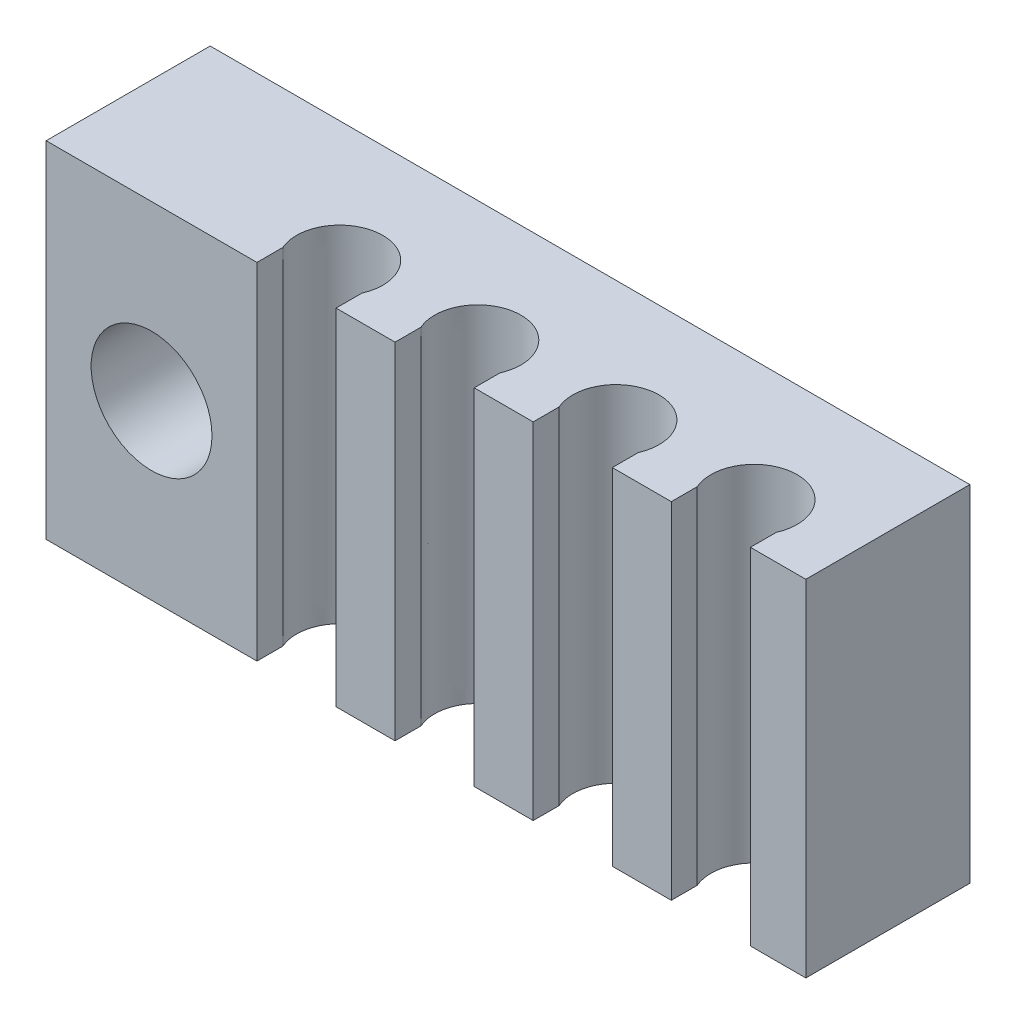
ISO-10303-21;
HEADER;
FILE_DESCRIPTION(('STEP AP214'),'2;1');
FILE_NAME('part.step','',(''),(''),'','','');
FILE_SCHEMA(('AUTOMOTIVE_DESIGN { 1 0 10303 214 1 1 1 1 }'));
ENDSEC;
DATA;
#1=APPLICATION_CONTEXT('core data for automotive mechanical design processes');
#2=APPLICATION_PROTOCOL_DEFINITION('international standard','automotive_design',2000,#1);
#3=PRODUCT_CONTEXT('',#1,'mechanical');
#4=PRODUCT('Part','Part','',(#3));
#5=PRODUCT_RELATED_PRODUCT_CATEGORY('part','',(#4));
#6=PRODUCT_DEFINITION_FORMATION('','',#4);
#7=PRODUCT_DEFINITION_CONTEXT('part definition',#1,'design');
#8=PRODUCT_DEFINITION('design','',#6,#7);
#9=PRODUCT_DEFINITION_SHAPE('','',#8);
#10=(LENGTH_UNIT() NAMED_UNIT(*) SI_UNIT(.MILLI.,.METRE.));
#11=(NAMED_UNIT(*) PLANE_ANGLE_UNIT() SI_UNIT($,.RADIAN.));
#12=(NAMED_UNIT(*) SI_UNIT($,.STERADIAN.) SOLID_ANGLE_UNIT());
#13=UNCERTAINTY_MEASURE_WITH_UNIT(LENGTH_MEASURE(1.E-05),#10,'distance_accuracy_value','');
#14=(GEOMETRIC_REPRESENTATION_CONTEXT(3) GLOBAL_UNCERTAINTY_ASSIGNED_CONTEXT((#13)) GLOBAL_UNIT_ASSIGNED_CONTEXT((#10,
#11,#12)) REPRESENTATION_CONTEXT('',''));
#15=CARTESIAN_POINT('',(0.,0.,0.));
#16=DIRECTION('',(0.,0.,1.));
#17=DIRECTION('',(1.,0.,0.));
#18=AXIS2_PLACEMENT_3D('',#15,#16,#17);
#19=CARTESIAN_POINT('',(1.10435607626104,10.,0.));
#20=DIRECTION('',(1.,0.,0.));
#21=DIRECTION('',(0.,0.,-1.));
#22=AXIS2_PLACEMENT_3D('',#19,#20,#21);
#23=PLANE('',#22);
#24=DIRECTION('',(0.,0.,1.));
#25=VECTOR('',#24,1.);
#26=CARTESIAN_POINT('',(1.10435607626104,0.,0.));
#27=LINE('',#26,#25);
#28=CARTESIAN_POINT('',(1.10435607626104,0.,0.));
#29=VERTEX_POINT('',#28);
#30=CARTESIAN_POINT('',(1.10435607626104,0.,0.750000000000005));
#31=VERTEX_POINT('',#30);
#32=EDGE_CURVE('E356',#29,#31,#27,.T.);
#33=ORIENTED_EDGE('',*,*,#32,.F.);
#34=CARTESIAN_POINT('',(1.10435607626104,10.,0.));
#35=DIRECTION('',(0.,-1.,0.));
#36=VECTOR('',#35,1.);
#37=LINE('',#34,#36);
#38=CARTESIAN_POINT('',(1.10435607626104,10.,0.));
#39=VERTEX_POINT('',#38);
#40=EDGE_CURVE('E11',#39,#29,#37,.T.);
#41=ORIENTED_EDGE('',*,*,#40,.F.);
#42=DIRECTION('',(0.,0.,1.));
#43=VECTOR('',#42,1.);
#44=CARTESIAN_POINT('',(1.10435607626104,10.,0.));
#45=LINE('',#44,#43);
#46=CARTESIAN_POINT('',(1.10435607626104,10.,0.750000000000005));
#47=VERTEX_POINT('',#46);
#48=EDGE_CURVE('E466',#39,#47,#45,.T.);
#49=ORIENTED_EDGE('',*,*,#48,.T.);
#50=DIRECTION('',(0.,-1.,0.));
#51=VECTOR('',#50,1.);
#52=CARTESIAN_POINT('',(1.10435607626104,10.,0.750000000000005));
#53=LINE('',#52,#51);
#54=EDGE_CURVE('E131',#47,#31,#53,.T.);
#55=ORIENTED_EDGE('',*,*,#54,.T.);
#56=EDGE_LOOP('',(#33,#41,#49,#55));
#57=FACE_BOUND('',#56,.T.);
#58=ADVANCED_FACE('F41',(#57),#23,.T.);
#59=CARTESIAN_POINT('',(3.39564392373896,10.,0.));
#60=CARTESIAN_POINT('',(3.45779822897416,10.,-0.142413404253852));
#61=CARTESIAN_POINT('',(3.48328316904731,10.,-0.296253527773759));
#62=CARTESIAN_POINT('',(3.50863389329829,10.,-0.449283455994029));
#63=CARTESIAN_POINT('',(3.49558614575293,10.,-0.604953101470896));
#64=CARTESIAN_POINT('',(3.48263027463405,10.,-0.75952659064273));
#65=CARTESIAN_POINT('',(3.43180131488979,10.,-0.907241515718572));
#66=CARTESIAN_POINT('',(3.38133027003981,10.,-1.05391629808722));
#67=CARTESIAN_POINT('',(3.29582503316759,10.,-1.18465319688146));
#68=CARTESIAN_POINT('',(3.21092188608777,10.,-1.3144695046671));
#69=CARTESIAN_POINT('',(3.0959635403377,10.,-1.42024219008873));
#70=CARTESIAN_POINT('',(2.98181468005355,10.,-1.52527007137299));
#71=CARTESIAN_POINT('',(2.84442556468332,10.,-1.59961731891186));
#72=CARTESIAN_POINT('',(2.70800388226732,10.,-1.6734410462495));
#73=CARTESIAN_POINT('',(2.55657654130753,10.,-1.71182128398536));
#74=CARTESIAN_POINT('',(2.40621548423372,10.,-1.74993126518247));
#75=CARTESIAN_POINT('',(2.25,10.,-1.75));
#76=CARTESIAN_POINT('',(2.09488451562459,10.,-1.75006825081757));
#77=CARTESIAN_POINT('',(1.94342345869247,10.,-1.71182128398536));
#78=CARTESIAN_POINT('',(1.79302892305929,10.,-1.67384363525757));
#79=CARTESIAN_POINT('',(1.65557443531667,10.,-1.59961731891186));
#80=CARTESIAN_POINT('',(1.51908784085161,10.,-1.5259136712239));
#81=CARTESIAN_POINT('',(1.4040364596623,10.,-1.42024219008873));
#82=CARTESIAN_POINT('',(1.28979521905302,10.,-1.31531480045542));
#83=CARTESIAN_POINT('',(1.2041749668324,10.,-1.18465319688146));
#84=CARTESIAN_POINT('',(1.11915761429082,10.,-1.05491165412037));
#85=CARTESIAN_POINT('',(1.06819868511021,10.,-0.907241515718572));
#86=CARTESIAN_POINT('',(1.01759858601069,10.,-0.760611204655972));
#87=CARTESIAN_POINT('',(1.00441385424707,10.,-0.604953101470895));
#88=CARTESIAN_POINT('',(0.991321963491766,10.,-0.450391073314972));
#89=CARTESIAN_POINT('',(1.0167168309527,10.,-0.296253527773758));
#90=CARTESIAN_POINT('',(1.04197835850478,10.,-0.142925306648315));
#91=CARTESIAN_POINT('',(1.10435607626104,10.,0.));
#92=B_SPLINE_CURVE_WITH_KNOTS('',2,(#59,#60,#61,#62,#63,#64,#65,#66,#67,#68,#69,#70,#71,#72,#73,
#74,#75,#76,#77,#78,#79,#80,#81,#82,#83,#84,#85,#86,#87,#88,#89,#90,#91),.UNSPECIFIED.,.F.,.F.,
(3,2,2,2,2,2,2,2,2,2,2,2,2,2,2,2,3),(0.,0.0625,0.125,0.1875,0.25,0.3125,0.375,0.4375,0.5,0.5625,
0.625,0.6875,0.75,0.8125,0.875,0.9375,1.),.UNSPECIFIED.);
#93=DIRECTION('',(0.,-1.,0.));
#94=VECTOR('',#93,1.);
#95=SURFACE_OF_LINEAR_EXTRUSION('',#92,#94);
#96=CARTESIAN_POINT('',(1.10435607626104,0.,0.));
#97=CARTESIAN_POINT('',(1.04197835850478,0.,-0.142925306648315));
#98=CARTESIAN_POINT('',(1.0167168309527,0.,-0.296253527773758));
#99=CARTESIAN_POINT('',(0.991321963491766,0.,-0.450391073314972));
#100=CARTESIAN_POINT('',(1.00441385424707,0.,-0.604953101470895));
#101=CARTESIAN_POINT('',(1.01759858601069,0.,-0.760611204655972));
#102=CARTESIAN_POINT('',(1.06819868511021,0.,-0.907241515718572));
#103=CARTESIAN_POINT('',(1.11915761429082,0.,-1.05491165412037));
#104=CARTESIAN_POINT('',(1.2041749668324,0.,-1.18465319688146));
#105=CARTESIAN_POINT('',(1.28979521905302,0.,-1.31531480045542));
#106=CARTESIAN_POINT('',(1.4040364596623,0.,-1.42024219008873));
#107=CARTESIAN_POINT('',(1.51908784085161,0.,-1.5259136712239));
#108=CARTESIAN_POINT('',(1.65557443531667,0.,-1.59961731891186));
#109=CARTESIAN_POINT('',(1.79302892305929,0.,-1.67384363525757));
#110=CARTESIAN_POINT('',(1.94342345869247,0.,-1.71182128398536));
#111=CARTESIAN_POINT('',(2.09488451562459,0.,-1.75006825081757));
#112=CARTESIAN_POINT('',(2.25,0.,-1.75));
#113=CARTESIAN_POINT('',(2.40621548423372,0.,-1.74993126518247));
#114=CARTESIAN_POINT('',(2.55657654130753,0.,-1.71182128398536));
#115=CARTESIAN_POINT('',(2.70800388226732,0.,-1.6734410462495));
#116=CARTESIAN_POINT('',(2.84442556468332,0.,-1.59961731891186));
#117=CARTESIAN_POINT('',(2.98181468005355,0.,-1.52527007137299));
#118=CARTESIAN_POINT('',(3.0959635403377,0.,-1.42024219008873));
#119=CARTESIAN_POINT('',(3.21092188608777,0.,-1.3144695046671));
#120=CARTESIAN_POINT('',(3.29582503316759,0.,-1.18465319688146));
#121=CARTESIAN_POINT('',(3.38133027003981,0.,-1.05391629808722));
#122=CARTESIAN_POINT('',(3.43180131488979,0.,-0.907241515718572));
#123=CARTESIAN_POINT('',(3.48263027463405,0.,-0.75952659064273));
#124=CARTESIAN_POINT('',(3.49558614575293,0.,-0.604953101470896));
#125=CARTESIAN_POINT('',(3.50863389329829,0.,-0.449283455994029));
#126=CARTESIAN_POINT('',(3.48328316904731,0.,-0.296253527773759));
#127=CARTESIAN_POINT('',(3.45779822897416,0.,-0.142413404253852));
#128=CARTESIAN_POINT('',(3.39564392373896,0.,0.));
#129=B_SPLINE_CURVE_WITH_KNOTS('',2,(#96,#97,#98,#99,#100,#101,#102,#103,#104,#105,#106,#107,
#108,#109,#110,#111,#112,#113,#114,#115,#116,#117,#118,#119,#120,#121,#122,#123,#124,#125,#126,
#127,#128),.UNSPECIFIED.,.F.,.F.,(3,2,2,2,2,2,2,2,2,2,2,2,2,2,2,2,3),(0.,0.0625,0.125,0.1875,
0.25,0.3125,0.375,0.4375,0.5,0.5625,0.625,0.6875,0.75,0.8125,0.875,0.9375,1.),.UNSPECIFIED.);
#130=CARTESIAN_POINT('',(3.39564392373896,0.,0.));
#131=VERTEX_POINT('',#130);
#132=EDGE_CURVE('E352',#131,#29,#129,.F.);
#133=ORIENTED_EDGE('',*,*,#132,.F.);
#134=CARTESIAN_POINT('',(3.39564392373896,0.,0.));
#135=DIRECTION('',(0.,1.,0.));
#136=VECTOR('',#135,1.);
#137=LINE('',#134,#136);
#138=CARTESIAN_POINT('',(3.39564392373896,10.,0.));
#139=VERTEX_POINT('',#138);
#140=EDGE_CURVE('E52',#139,#131,#137,.F.);
#141=ORIENTED_EDGE('',*,*,#140,.F.);
#142=CARTESIAN_POINT('',(3.39564392373896,10.,0.));
#143=CARTESIAN_POINT('',(3.45779822897416,10.,-0.142413404253852));
#144=CARTESIAN_POINT('',(3.48328316904731,10.,-0.296253527773759));
#145=CARTESIAN_POINT('',(3.50863389329829,10.,-0.449283455994029));
#146=CARTESIAN_POINT('',(3.49558614575293,10.,-0.604953101470896));
#147=CARTESIAN_POINT('',(3.48263027463405,10.,-0.75952659064273));
#148=CARTESIAN_POINT('',(3.43180131488979,10.,-0.907241515718572));
#149=CARTESIAN_POINT('',(3.38133027003981,10.,-1.05391629808722));
#150=CARTESIAN_POINT('',(3.29582503316759,10.,-1.18465319688146));
#151=CARTESIAN_POINT('',(3.21092188608777,10.,-1.3144695046671));
#152=CARTESIAN_POINT('',(3.0959635403377,10.,-1.42024219008873));
#153=CARTESIAN_POINT('',(2.98181468005355,10.,-1.52527007137299));
#154=CARTESIAN_POINT('',(2.84442556468332,10.,-1.59961731891186));
#155=CARTESIAN_POINT('',(2.70800388226732,10.,-1.6734410462495));
#156=CARTESIAN_POINT('',(2.55657654130753,10.,-1.71182128398536));
#157=CARTESIAN_POINT('',(2.40621548423372,10.,-1.74993126518247));
#158=CARTESIAN_POINT('',(2.25,10.,-1.75));
#159=CARTESIAN_POINT('',(2.09488451562459,10.,-1.75006825081757));
#160=CARTESIAN_POINT('',(1.94342345869247,10.,-1.71182128398536));
#161=CARTESIAN_POINT('',(1.79302892305929,10.,-1.67384363525757));
#162=CARTESIAN_POINT('',(1.65557443531667,10.,-1.59961731891186));
#163=CARTESIAN_POINT('',(1.51908784085161,10.,-1.5259136712239));
#164=CARTESIAN_POINT('',(1.4040364596623,10.,-1.42024219008873));
#165=CARTESIAN_POINT('',(1.28979521905302,10.,-1.31531480045542));
#166=CARTESIAN_POINT('',(1.2041749668324,10.,-1.18465319688146));
#167=CARTESIAN_POINT('',(1.11915761429082,10.,-1.05491165412037));
#168=CARTESIAN_POINT('',(1.06819868511021,10.,-0.907241515718572));
#169=CARTESIAN_POINT('',(1.01759858601069,10.,-0.760611204655972));
#170=CARTESIAN_POINT('',(1.00441385424707,10.,-0.604953101470895));
#171=CARTESIAN_POINT('',(0.991321963491766,10.,-0.450391073314972));
#172=CARTESIAN_POINT('',(1.0167168309527,10.,-0.296253527773758));
#173=CARTESIAN_POINT('',(1.04197835850478,10.,-0.142925306648315));
#174=CARTESIAN_POINT('',(1.10435607626104,10.,0.));
#175=B_SPLINE_CURVE_WITH_KNOTS('',2,(#142,#143,#144,#145,#146,#147,#148,#149,#150,#151,#152,
#153,#154,#155,#156,#157,#158,#159,#160,#161,#162,#163,#164,#165,#166,#167,#168,#169,#170,#171,
#172,#173,#174),.UNSPECIFIED.,.F.,.F.,(3,2,2,2,2,2,2,2,2,2,2,2,2,2,2,2,3),(0.,0.0625,0.125,
0.1875,0.25,0.3125,0.375,0.4375,0.5,0.5625,0.625,0.6875,0.75,0.8125,0.875,0.9375,1.),.UNSPECIFIED.);
#176=EDGE_CURVE('E354',#139,#39,#175,.T.);
#177=ORIENTED_EDGE('',*,*,#176,.T.);
#178=ORIENTED_EDGE('',*,*,#40,.T.);
#179=EDGE_LOOP('',(#133,#141,#177,#178));
#180=FACE_BOUND('',#179,.T.);
#181=ADVANCED_FACE('F312',(#180),#95,.T.);
#182=CARTESIAN_POINT('',(3.39564392373896,10.,0.));
#183=DIRECTION('',(1.,0.,0.));
#184=DIRECTION('',(0.,0.,-1.));
#185=AXIS2_PLACEMENT_3D('',#182,#183,#184);
#186=PLANE('',#185);
#187=DIRECTION('',(0.,0.,1.));
#188=VECTOR('',#187,1.);
#189=CARTESIAN_POINT('',(3.39564392373896,0.,0.));
#190=LINE('',#189,#188);
#191=CARTESIAN_POINT('',(3.39564392373896,0.,0.750000000000006));
#192=VERTEX_POINT('',#191);
#193=EDGE_CURVE('E362',#131,#192,#190,.T.);
#194=ORIENTED_EDGE('',*,*,#193,.T.);
#195=DIRECTION('',(0.,-1.,0.));
#196=VECTOR('',#195,1.);
#197=CARTESIAN_POINT('',(3.39564392373896,10.,0.750000000000006));
#198=LINE('',#197,#196);
#199=CARTESIAN_POINT('',(3.39564392373896,10.,0.750000000000006));
#200=VERTEX_POINT('',#199);
#201=EDGE_CURVE('E381',#200,#192,#198,.T.);
#202=ORIENTED_EDGE('',*,*,#201,.F.);
#203=DIRECTION('',(0.,0.,1.));
#204=VECTOR('',#203,1.);
#205=CARTESIAN_POINT('',(3.39564392373896,10.,0.));
#206=LINE('',#205,#204);
#207=EDGE_CURVE('E380',#139,#200,#206,.T.);
#208=ORIENTED_EDGE('',*,*,#207,.F.);
#209=ORIENTED_EDGE('',*,*,#140,.T.);
#210=EDGE_LOOP('',(#194,#202,#208,#209));
#211=FACE_BOUND('',#210,.T.);
#212=ADVANCED_FACE('F316',(#211),#186,.F.);
#213=CARTESIAN_POINT('',(0.,10.,0.750000000000004));
#214=DIRECTION('',(0.,0.,-1.));
#215=DIRECTION('',(-1.,0.,0.));
#216=AXIS2_PLACEMENT_3D('',#213,#214,#215);
#217=PLANE('',#216);
#218=DIRECTION('',(1.,0.,0.));
#219=VECTOR('',#218,1.);
#220=CARTESIAN_POINT('',(0.,0.,0.750000000000004));
#221=LINE('',#220,#219);
#222=CARTESIAN_POINT('',(5.10435607626104,0.,0.750000000000007));
#223=VERTEX_POINT('',#222);
#224=EDGE_CURVE('E212',#192,#223,#221,.T.);
#225=ORIENTED_EDGE('',*,*,#224,.T.);
#226=DIRECTION('',(0.,-1.,0.));
#227=VECTOR('',#226,1.);
#228=CARTESIAN_POINT('',(5.10435607626104,10.,0.750000000000007));
#229=LINE('',#228,#227);
#230=CARTESIAN_POINT('',(5.10435607626104,10.,0.750000000000007));
#231=VERTEX_POINT('',#230);
#232=EDGE_CURVE('E382',#231,#223,#229,.T.);
#233=ORIENTED_EDGE('',*,*,#232,.F.);
#234=DIRECTION('',(1.,0.,0.));
#235=VECTOR('',#234,1.);
#236=CARTESIAN_POINT('',(0.,10.,0.750000000000004));
#237=LINE('',#236,#235);
#238=EDGE_CURVE('E444',#200,#231,#237,.T.);
#239=ORIENTED_EDGE('',*,*,#238,.F.);
#240=ORIENTED_EDGE('',*,*,#201,.T.);
#241=EDGE_LOOP('',(#225,#233,#239,#240));
#242=FACE_BOUND('',#241,.T.);
#243=ADVANCED_FACE('F443',(#242),#217,.F.);
#244=CARTESIAN_POINT('',(5.10435607626104,10.,0.));
#245=DIRECTION('',(1.,0.,0.));
#246=DIRECTION('',(0.,0.,-1.));
#247=AXIS2_PLACEMENT_3D('',#244,#245,#246);
#248=PLANE('',#247);
#249=DIRECTION('',(0.,0.,1.));
#250=VECTOR('',#249,1.);
#251=CARTESIAN_POINT('',(5.10435607626104,0.,0.));
#252=LINE('',#251,#250);
#253=CARTESIAN_POINT('',(5.10435607626104,0.,0.));
#254=VERTEX_POINT('',#253);
#255=EDGE_CURVE('E258',#254,#223,#252,.T.);
#256=ORIENTED_EDGE('',*,*,#255,.F.);
#257=CARTESIAN_POINT('',(5.10435607626104,10.,0.));
#258=DIRECTION('',(0.,-1.,0.));
#259=VECTOR('',#258,1.);
#260=LINE('',#257,#259);
#261=CARTESIAN_POINT('',(5.10435607626104,10.,0.));
#262=VERTEX_POINT('',#261);
#263=EDGE_CURVE('E387',#262,#254,#260,.T.);
#264=ORIENTED_EDGE('',*,*,#263,.F.);
#265=DIRECTION('',(0.,0.,1.));
#266=VECTOR('',#265,1.);
#267=CARTESIAN_POINT('',(5.10435607626104,10.,0.));
#268=LINE('',#267,#266);
#269=EDGE_CURVE('E445',#262,#231,#268,.T.);
#270=ORIENTED_EDGE('',*,*,#269,.T.);
#271=ORIENTED_EDGE('',*,*,#232,.T.);
#272=EDGE_LOOP('',(#256,#264,#270,#271));
#273=FACE_BOUND('',#272,.T.);
#274=ADVANCED_FACE('F287',(#273),#248,.T.);
#275=CARTESIAN_POINT('',(7.39564392373896,10.,0.));
#276=CARTESIAN_POINT('',(7.45779822897436,10.,-0.142413404254305));
#277=CARTESIAN_POINT('',(7.48328316904731,10.,-0.296253527773759));
#278=CARTESIAN_POINT('',(7.50863389329825,10.,-0.449283455994519));
#279=CARTESIAN_POINT('',(7.49558614575293,10.,-0.604953101470896));
#280=CARTESIAN_POINT('',(7.48263027463405,10.,-0.759526590642753));
#281=CARTESIAN_POINT('',(7.43180131488979,10.,-0.907241515718571));
#282=CARTESIAN_POINT('',(7.38133027003973,10.,-1.05391629808743));
#283=CARTESIAN_POINT('',(7.29582503316759,10.,-1.18465319688146));
#284=CARTESIAN_POINT('',(7.21092188608761,10.,-1.31446950466724));
#285=CARTESIAN_POINT('',(7.0959635403377,10.,-1.42024219008873));
#286=CARTESIAN_POINT('',(6.98181468005347,10.,-1.52527007137307));
#287=CARTESIAN_POINT('',(6.84442556468332,10.,-1.59961731891186));
#288=CARTESIAN_POINT('',(6.70800388226721,10.,-1.67344104624953));
#289=CARTESIAN_POINT('',(6.55657654130753,10.,-1.71182128398536));
#290=CARTESIAN_POINT('',(6.4062154842336,10.,-1.7499312651825));
#291=CARTESIAN_POINT('',(6.25,10.,-1.75));
#292=CARTESIAN_POINT('',(6.09488451562447,10.,-1.75006825081753));
#293=CARTESIAN_POINT('',(5.94342345869247,10.,-1.71182128398536));
#294=CARTESIAN_POINT('',(5.79302892305929,10.,-1.67384363525757));
#295=CARTESIAN_POINT('',(5.65557443531668,10.,-1.59961731891186));
#296=CARTESIAN_POINT('',(5.51908784085145,10.,-1.52591367122381));
#297=CARTESIAN_POINT('',(5.4040364596623,10.,-1.42024219008873));
#298=CARTESIAN_POINT('',(5.28979521905269,10.,-1.31531480045505));
#299=CARTESIAN_POINT('',(5.20417496683241,10.,-1.18465319688146));
#300=CARTESIAN_POINT('',(5.1191576142905,10.,-1.05491165411974));
#301=CARTESIAN_POINT('',(5.06819868511021,10.,-0.907241515718572));
#302=CARTESIAN_POINT('',(5.01759858601061,10.,-0.76061120465546));
#303=CARTESIAN_POINT('',(5.00441385424707,10.,-0.604953101470897));
#304=CARTESIAN_POINT('',(4.9913219634918,10.,-0.450391073314973));
#305=CARTESIAN_POINT('',(5.0167168309527,10.,-0.296253527773759));
#306=CARTESIAN_POINT('',(5.04197835850474,10.,-0.14292530664843));
#307=CARTESIAN_POINT('',(5.10435607626104,10.,0.));
#308=B_SPLINE_CURVE_WITH_KNOTS('',2,(#275,#276,#277,#278,#279,#280,#281,#282,#283,#284,#285,
#286,#287,#288,#289,#290,#291,#292,#293,#294,#295,#296,#297,#298,#299,#300,#301,#302,#303,#304,
#305,#306,#307),.UNSPECIFIED.,.F.,.F.,(3,2,2,2,2,2,2,2,2,2,2,2,2,2,2,2,3),(0.,0.0625,0.125,
0.1875,0.25,0.3125,0.375,0.4375,0.5,0.5625,0.625,0.6875,0.75,0.8125,0.875,0.9375,1.),.UNSPECIFIED.);
#309=DIRECTION('',(0.,-1.,0.));
#310=VECTOR('',#309,1.);
#311=SURFACE_OF_LINEAR_EXTRUSION('',#308,#310);
#312=CARTESIAN_POINT('',(5.10435607626104,0.,0.));
#313=CARTESIAN_POINT('',(5.04197835850474,0.,-0.14292530664843));
#314=CARTESIAN_POINT('',(5.0167168309527,0.,-0.296253527773759));
#315=CARTESIAN_POINT('',(4.9913219634918,0.,-0.450391073314973));
#316=CARTESIAN_POINT('',(5.00441385424707,0.,-0.604953101470897));
#317=CARTESIAN_POINT('',(5.01759858601061,0.,-0.76061120465546));
#318=CARTESIAN_POINT('',(5.06819868511021,0.,-0.907241515718572));
#319=CARTESIAN_POINT('',(5.1191576142905,0.,-1.05491165411974));
#320=CARTESIAN_POINT('',(5.20417496683241,0.,-1.18465319688146));
#321=CARTESIAN_POINT('',(5.28979521905269,0.,-1.31531480045505));
#322=CARTESIAN_POINT('',(5.4040364596623,0.,-1.42024219008873));
#323=CARTESIAN_POINT('',(5.51908784085145,0.,-1.52591367122381));
#324=CARTESIAN_POINT('',(5.65557443531668,0.,-1.59961731891186));
#325=CARTESIAN_POINT('',(5.79302892305929,0.,-1.67384363525757));
#326=CARTESIAN_POINT('',(5.94342345869247,0.,-1.71182128398536));
#327=CARTESIAN_POINT('',(6.09488451562447,0.,-1.75006825081753));
#328=CARTESIAN_POINT('',(6.25,0.,-1.75));
#329=CARTESIAN_POINT('',(6.4062154842336,0.,-1.7499312651825));
#330=CARTESIAN_POINT('',(6.55657654130753,0.,-1.71182128398536));
#331=CARTESIAN_POINT('',(6.70800388226721,0.,-1.67344104624953));
#332=CARTESIAN_POINT('',(6.84442556468332,0.,-1.59961731891186));
#333=CARTESIAN_POINT('',(6.98181468005347,0.,-1.52527007137307));
#334=CARTESIAN_POINT('',(7.0959635403377,0.,-1.42024219008873));
#335=CARTESIAN_POINT('',(7.21092188608761,0.,-1.31446950466724));
#336=CARTESIAN_POINT('',(7.29582503316759,0.,-1.18465319688146));
#337=CARTESIAN_POINT('',(7.38133027003973,0.,-1.05391629808743));
#338=CARTESIAN_POINT('',(7.43180131488979,0.,-0.907241515718571));
#339=CARTESIAN_POINT('',(7.48263027463405,0.,-0.759526590642753));
#340=CARTESIAN_POINT('',(7.49558614575293,0.,-0.604953101470896));
#341=CARTESIAN_POINT('',(7.50863389329825,0.,-0.449283455994519));
#342=CARTESIAN_POINT('',(7.48328316904731,0.,-0.296253527773759));
#343=CARTESIAN_POINT('',(7.45779822897436,0.,-0.142413404254305));
#344=CARTESIAN_POINT('',(7.39564392373896,0.,0.));
#345=B_SPLINE_CURVE_WITH_KNOTS('',2,(#312,#313,#314,#315,#316,#317,#318,#319,#320,#321,#322,
#323,#324,#325,#326,#327,#328,#329,#330,#331,#332,#333,#334,#335,#336,#337,#338,#339,#340,#341,
#342,#343,#344),.UNSPECIFIED.,.F.,.F.,(3,2,2,2,2,2,2,2,2,2,2,2,2,2,2,2,3),(0.,0.0625,0.125,
0.1875,0.25,0.3125,0.375,0.4375,0.5,0.5625,0.625,0.6875,0.75,0.8125,0.875,0.9375,1.),.UNSPECIFIED.);
#346=CARTESIAN_POINT('',(7.39564392373896,0.,0.));
#347=VERTEX_POINT('',#346);
#348=EDGE_CURVE('E249',#347,#254,#345,.F.);
#349=ORIENTED_EDGE('',*,*,#348,.F.);
#350=CARTESIAN_POINT('',(7.39564392373896,0.,0.));
#351=DIRECTION('',(0.,1.,0.));
#352=VECTOR('',#351,1.);
#353=LINE('',#350,#352);
#354=CARTESIAN_POINT('',(7.39564392373896,10.,0.));
#355=VERTEX_POINT('',#354);
#356=EDGE_CURVE('E265',#355,#347,#353,.F.);
#357=ORIENTED_EDGE('',*,*,#356,.F.);
#358=CARTESIAN_POINT('',(7.39564392373896,10.,0.));
#359=CARTESIAN_POINT('',(7.45779822897436,10.,-0.142413404254305));
#360=CARTESIAN_POINT('',(7.48328316904731,10.,-0.296253527773759));
#361=CARTESIAN_POINT('',(7.50863389329825,10.,-0.449283455994519));
#362=CARTESIAN_POINT('',(7.49558614575293,10.,-0.604953101470896));
#363=CARTESIAN_POINT('',(7.48263027463405,10.,-0.759526590642753));
#364=CARTESIAN_POINT('',(7.43180131488979,10.,-0.907241515718571));
#365=CARTESIAN_POINT('',(7.38133027003973,10.,-1.05391629808743));
#366=CARTESIAN_POINT('',(7.29582503316759,10.,-1.18465319688146));
#367=CARTESIAN_POINT('',(7.21092188608761,10.,-1.31446950466724));
#368=CARTESIAN_POINT('',(7.0959635403377,10.,-1.42024219008873));
#369=CARTESIAN_POINT('',(6.98181468005347,10.,-1.52527007137307));
#370=CARTESIAN_POINT('',(6.84442556468332,10.,-1.59961731891186));
#371=CARTESIAN_POINT('',(6.70800388226721,10.,-1.67344104624953));
#372=CARTESIAN_POINT('',(6.55657654130753,10.,-1.71182128398536));
#373=CARTESIAN_POINT('',(6.4062154842336,10.,-1.7499312651825));
#374=CARTESIAN_POINT('',(6.25,10.,-1.75));
#375=CARTESIAN_POINT('',(6.09488451562447,10.,-1.75006825081753));
#376=CARTESIAN_POINT('',(5.94342345869247,10.,-1.71182128398536));
#377=CARTESIAN_POINT('',(5.79302892305929,10.,-1.67384363525757));
#378=CARTESIAN_POINT('',(5.65557443531668,10.,-1.59961731891186));
#379=CARTESIAN_POINT('',(5.51908784085145,10.,-1.52591367122381));
#380=CARTESIAN_POINT('',(5.4040364596623,10.,-1.42024219008873));
#381=CARTESIAN_POINT('',(5.28979521905269,10.,-1.31531480045505));
#382=CARTESIAN_POINT('',(5.20417496683241,10.,-1.18465319688146));
#383=CARTESIAN_POINT('',(5.1191576142905,10.,-1.05491165411974));
#384=CARTESIAN_POINT('',(5.06819868511021,10.,-0.907241515718572));
#385=CARTESIAN_POINT('',(5.01759858601061,10.,-0.76061120465546));
#386=CARTESIAN_POINT('',(5.00441385424707,10.,-0.604953101470897));
#387=CARTESIAN_POINT('',(4.9913219634918,10.,-0.450391073314973));
#388=CARTESIAN_POINT('',(5.0167168309527,10.,-0.296253527773759));
#389=CARTESIAN_POINT('',(5.04197835850474,10.,-0.14292530664843));
#390=CARTESIAN_POINT('',(5.10435607626104,10.,0.));
#391=B_SPLINE_CURVE_WITH_KNOTS('',2,(#358,#359,#360,#361,#362,#363,#364,#365,#366,#367,#368,
#369,#370,#371,#372,#373,#374,#375,#376,#377,#378,#379,#380,#381,#382,#383,#384,#385,#386,#387,
#388,#389,#390),.UNSPECIFIED.,.F.,.F.,(3,2,2,2,2,2,2,2,2,2,2,2,2,2,2,2,3),(0.,0.0625,0.125,
0.1875,0.25,0.3125,0.375,0.4375,0.5,0.5625,0.625,0.6875,0.75,0.8125,0.875,0.9375,1.),.UNSPECIFIED.);
#392=EDGE_CURVE('E427',#355,#262,#391,.T.);
#393=ORIENTED_EDGE('',*,*,#392,.T.);
#394=ORIENTED_EDGE('',*,*,#263,.T.);
#395=EDGE_LOOP('',(#349,#357,#393,#394));
#396=FACE_BOUND('',#395,.T.);
#397=ADVANCED_FACE('F281',(#396),#311,.T.);
#398=CARTESIAN_POINT('',(7.39564392373896,10.,0.));
#399=DIRECTION('',(1.,0.,0.));
#400=DIRECTION('',(0.,0.,-1.));
#401=AXIS2_PLACEMENT_3D('',#398,#399,#400);
#402=PLANE('',#401);
#403=DIRECTION('',(0.,0.,1.));
#404=VECTOR('',#403,1.);
#405=CARTESIAN_POINT('',(7.39564392373896,0.,0.));
#406=LINE('',#405,#404);
#407=CARTESIAN_POINT('',(7.39564392373896,0.,0.750000000000009));
#408=VERTEX_POINT('',#407);
#409=EDGE_CURVE('E254',#347,#408,#406,.T.);
#410=ORIENTED_EDGE('',*,*,#409,.T.);
#411=DIRECTION('',(0.,-1.,0.));
#412=VECTOR('',#411,1.);
#413=CARTESIAN_POINT('',(7.39564392373896,10.,0.750000000000009));
#414=LINE('',#413,#412);
#415=CARTESIAN_POINT('',(7.39564392373896,10.,0.750000000000009));
#416=VERTEX_POINT('',#415);
#417=EDGE_CURVE('E544',#416,#408,#414,.T.);
#418=ORIENTED_EDGE('',*,*,#417,.F.);
#419=DIRECTION('',(0.,0.,1.));
#420=VECTOR('',#419,1.);
#421=CARTESIAN_POINT('',(7.39564392373896,10.,0.));
#422=LINE('',#421,#420);
#423=EDGE_CURVE('E447',#355,#416,#422,.T.);
#424=ORIENTED_EDGE('',*,*,#423,.F.);
#425=ORIENTED_EDGE('',*,*,#356,.T.);
#426=EDGE_LOOP('',(#410,#418,#424,#425));
#427=FACE_BOUND('',#426,.T.);
#428=ADVANCED_FACE('F271',(#427),#402,.F.);
#429=CARTESIAN_POINT('',(0.,10.,0.750000000000004));
#430=DIRECTION('',(0.,0.,-1.));
#431=DIRECTION('',(-1.,0.,0.));
#432=AXIS2_PLACEMENT_3D('',#429,#430,#431);
#433=PLANE('',#432);
#434=DIRECTION('',(1.,0.,0.));
#435=VECTOR('',#434,1.);
#436=CARTESIAN_POINT('',(0.,0.,0.750000000000004));
#437=LINE('',#436,#435);
#438=CARTESIAN_POINT('',(9.10435607626104,0.,0.75000000000001));
#439=VERTEX_POINT('',#438);
#440=EDGE_CURVE('E235',#408,#439,#437,.T.);
#441=ORIENTED_EDGE('',*,*,#440,.T.);
#442=DIRECTION('',(0.,-1.,0.));
#443=VECTOR('',#442,1.);
#444=CARTESIAN_POINT('',(9.10435607626104,10.,0.75000000000001));
#445=LINE('',#444,#443);
#446=CARTESIAN_POINT('',(9.10435607626104,10.,0.75000000000001));
#447=VERTEX_POINT('',#446);
#448=EDGE_CURVE('E543',#447,#439,#445,.T.);
#449=ORIENTED_EDGE('',*,*,#448,.F.);
#450=DIRECTION('',(1.,0.,0.));
#451=VECTOR('',#450,1.);
#452=CARTESIAN_POINT('',(0.,10.,0.750000000000004));
#453=LINE('',#452,#451);
#454=EDGE_CURVE('E481',#416,#447,#453,.T.);
#455=ORIENTED_EDGE('',*,*,#454,.F.);
#456=ORIENTED_EDGE('',*,*,#417,.T.);
#457=EDGE_LOOP('',(#441,#449,#455,#456));
#458=FACE_BOUND('',#457,.T.);
#459=ADVANCED_FACE('F280',(#458),#433,.F.);
#460=CARTESIAN_POINT('',(9.10435607626104,10.,0.));
#461=DIRECTION('',(1.,0.,0.));
#462=DIRECTION('',(0.,0.,-1.));
#463=AXIS2_PLACEMENT_3D('',#460,#461,#462);
#464=PLANE('',#463);
#465=DIRECTION('',(0.,0.,1.));
#466=VECTOR('',#465,1.);
#467=CARTESIAN_POINT('',(9.10435607626104,0.,0.));
#468=LINE('',#467,#466);
#469=CARTESIAN_POINT('',(9.10435607626104,0.,0.));
#470=VERTEX_POINT('',#469);
#471=EDGE_CURVE('E551',#470,#439,#468,.T.);
#472=ORIENTED_EDGE('',*,*,#471,.F.);
#473=CARTESIAN_POINT('',(9.10435607626104,10.,0.));
#474=DIRECTION('',(0.,-1.,0.));
#475=VECTOR('',#474,1.);
#476=LINE('',#473,#475);
#477=CARTESIAN_POINT('',(9.10435607626104,10.,0.));
#478=VERTEX_POINT('',#477);
#479=EDGE_CURVE('E395',#478,#470,#476,.T.);
#480=ORIENTED_EDGE('',*,*,#479,.F.);
#481=DIRECTION('',(0.,0.,1.));
#482=VECTOR('',#481,1.);
#483=CARTESIAN_POINT('',(9.10435607626104,10.,0.));
#484=LINE('',#483,#482);
#485=EDGE_CURVE('E483',#478,#447,#484,.T.);
#486=ORIENTED_EDGE('',*,*,#485,.T.);
#487=ORIENTED_EDGE('',*,*,#448,.T.);
#488=EDGE_LOOP('',(#472,#480,#486,#487));
#489=FACE_BOUND('',#488,.T.);
#490=ADVANCED_FACE('F412',(#489),#464,.T.);
#491=CARTESIAN_POINT('',(10.25,10.,-0.500000000000002));
#492=DIRECTION('',(0.,-1.,0.));
#493=DIRECTION('',(0.,0.,-1.));
#494=AXIS2_PLACEMENT_3D('',#491,#492,#493);
#495=CYLINDRICAL_SURFACE('',#494,1.25);
#496=CARTESIAN_POINT('',(10.25,0.,-0.500000000000002));
#497=DIRECTION('',(0.,1.,0.));
#498=DIRECTION('',(0.,0.,1.));
#499=AXIS2_PLACEMENT_3D('',#496,#497,#498);
#500=CIRCLE('',#499,1.25);
#501=CARTESIAN_POINT('',(11.395643923739,0.,0.));
#502=VERTEX_POINT('',#501);
#503=EDGE_CURVE('E552',#502,#470,#500,.T.);
#504=ORIENTED_EDGE('',*,*,#503,.F.);
#505=DIRECTION('',(0.,-1.,0.));
#506=VECTOR('',#505,1.);
#507=CARTESIAN_POINT('',(11.395643923739,10.,0.));
#508=LINE('',#507,#506);
#509=CARTESIAN_POINT('',(11.395643923739,10.,0.));
#510=VERTEX_POINT('',#509);
#511=EDGE_CURVE('E541',#510,#502,#508,.T.);
#512=ORIENTED_EDGE('',*,*,#511,.F.);
#513=CARTESIAN_POINT('',(10.25,10.,-0.500000000000002));
#514=DIRECTION('',(0.,1.,0.));
#515=DIRECTION('',(0.,0.,1.));
#516=AXIS2_PLACEMENT_3D('',#513,#514,#515);
#517=CIRCLE('',#516,1.25);
#518=EDGE_CURVE('E489',#510,#478,#517,.T.);
#519=ORIENTED_EDGE('',*,*,#518,.T.);
#520=ORIENTED_EDGE('',*,*,#479,.T.);
#521=EDGE_LOOP('',(#504,#512,#519,#520));
#522=FACE_BOUND('',#521,.T.);
#523=ADVANCED_FACE('F402',(#522),#495,.F.);
#524=CARTESIAN_POINT('',(11.395643923739,10.,0.));
#525=DIRECTION('',(1.,0.,0.));
#526=DIRECTION('',(0.,0.,-1.));
#527=AXIS2_PLACEMENT_3D('',#524,#525,#526);
#528=PLANE('',#527);
#529=DIRECTION('',(0.,0.,1.));
#530=VECTOR('',#529,1.);
#531=CARTESIAN_POINT('',(11.395643923739,0.,0.));
#532=LINE('',#531,#530);
#533=CARTESIAN_POINT('',(11.395643923739,0.,0.750000000000011));
#534=VERTEX_POINT('',#533);
#535=EDGE_CURVE('E553',#502,#534,#532,.T.);
#536=ORIENTED_EDGE('',*,*,#535,.T.);
#537=DIRECTION('',(0.,-1.,0.));
#538=VECTOR('',#537,1.);
#539=CARTESIAN_POINT('',(11.395643923739,10.,0.750000000000011));
#540=LINE('',#539,#538);
#541=CARTESIAN_POINT('',(11.395643923739,10.,0.750000000000011));
#542=VERTEX_POINT('',#541);
#543=EDGE_CURVE('E538',#542,#534,#540,.T.);
#544=ORIENTED_EDGE('',*,*,#543,.F.);
#545=DIRECTION('',(0.,0.,1.));
#546=VECTOR('',#545,1.);
#547=CARTESIAN_POINT('',(11.395643923739,10.,0.));
#548=LINE('',#547,#546);
#549=EDGE_CURVE('E496',#510,#542,#548,.T.);
#550=ORIENTED_EDGE('',*,*,#549,.F.);
#551=ORIENTED_EDGE('',*,*,#511,.T.);
#552=EDGE_LOOP('',(#536,#544,#550,#551));
#553=FACE_BOUND('',#552,.T.);
#554=ADVANCED_FACE('F411',(#553),#528,.F.);
#555=CARTESIAN_POINT('',(0.,10.,0.750000000000004));
#556=DIRECTION('',(0.,0.,-1.));
#557=DIRECTION('',(-1.,0.,0.));
#558=AXIS2_PLACEMENT_3D('',#555,#556,#557);
#559=PLANE('',#558);
#560=DIRECTION('',(1.,0.,0.));
#561=VECTOR('',#560,1.);
#562=CARTESIAN_POINT('',(0.,0.,0.750000000000004));
#563=LINE('',#562,#561);
#564=CARTESIAN_POINT('',(13.104356076261,0.,0.750000000000012));
#565=VERTEX_POINT('',#564);
#566=EDGE_CURVE('E561',#534,#565,#563,.T.);
#567=ORIENTED_EDGE('',*,*,#566,.T.);
#568=DIRECTION('',(0.,-1.,0.));
#569=VECTOR('',#568,1.);
#570=CARTESIAN_POINT('',(13.104356076261,10.,0.750000000000012));
#571=LINE('',#570,#569);
#572=CARTESIAN_POINT('',(13.104356076261,10.,0.750000000000012));
#573=VERTEX_POINT('',#572);
#574=EDGE_CURVE('E536',#573,#565,#571,.T.);
#575=ORIENTED_EDGE('',*,*,#574,.F.);
#576=DIRECTION('',(1.,0.,0.));
#577=VECTOR('',#576,1.);
#578=CARTESIAN_POINT('',(0.,10.,0.750000000000004));
#579=LINE('',#578,#577);
#580=EDGE_CURVE('E500',#542,#573,#579,.T.);
#581=ORIENTED_EDGE('',*,*,#580,.F.);
#582=ORIENTED_EDGE('',*,*,#543,.T.);
#583=EDGE_LOOP('',(#567,#575,#581,#582));
#584=FACE_BOUND('',#583,.T.);
#585=ADVANCED_FACE('F587',(#584),#559,.F.);
#586=CARTESIAN_POINT('',(13.104356076261,10.,0.));
#587=DIRECTION('',(1.,0.,0.));
#588=DIRECTION('',(0.,0.,-1.));
#589=AXIS2_PLACEMENT_3D('',#586,#587,#588);
#590=PLANE('',#589);
#591=DIRECTION('',(0.,0.,1.));
#592=VECTOR('',#591,1.);
#593=CARTESIAN_POINT('',(13.104356076261,0.,0.));
#594=LINE('',#593,#592);
#595=CARTESIAN_POINT('',(13.104356076261,0.,0.));
#596=VERTEX_POINT('',#595);
#597=EDGE_CURVE('E564',#596,#565,#594,.T.);
#598=ORIENTED_EDGE('',*,*,#597,.F.);
#599=DIRECTION('',(0.,-1.,0.));
#600=VECTOR('',#599,1.);
#601=CARTESIAN_POINT('',(13.104356076261,10.,0.));
#602=LINE('',#601,#600);
#603=CARTESIAN_POINT('',(13.104356076261,10.,0.));
#604=VERTEX_POINT('',#603);
#605=EDGE_CURVE('E534',#604,#596,#602,.T.);
#606=ORIENTED_EDGE('',*,*,#605,.F.);
#607=DIRECTION('',(0.,0.,1.));
#608=VECTOR('',#607,1.);
#609=CARTESIAN_POINT('',(13.104356076261,10.,0.));
#610=LINE('',#609,#608);
#611=EDGE_CURVE('E502',#604,#573,#610,.T.);
#612=ORIENTED_EDGE('',*,*,#611,.T.);
#613=ORIENTED_EDGE('',*,*,#574,.T.);
#614=EDGE_LOOP('',(#598,#606,#612,#613));
#615=FACE_BOUND('',#614,.T.);
#616=ADVANCED_FACE('F582',(#615),#590,.T.);
#617=CARTESIAN_POINT('',(14.25,10.,-0.500000000000003));
#618=DIRECTION('',(0.,-1.,0.));
#619=DIRECTION('',(0.,0.,-1.));
#620=AXIS2_PLACEMENT_3D('',#617,#618,#619);
#621=CYLINDRICAL_SURFACE('',#620,1.25);
#622=CARTESIAN_POINT('',(14.25,0.,-0.500000000000003));
#623=DIRECTION('',(0.,1.,0.));
#624=DIRECTION('',(0.,0.,1.));
#625=AXIS2_PLACEMENT_3D('',#622,#623,#624);
#626=CIRCLE('',#625,1.25);
#627=CARTESIAN_POINT('',(15.395643923739,0.,0.));
#628=VERTEX_POINT('',#627);
#629=EDGE_CURVE('E567',#628,#596,#626,.T.);
#630=ORIENTED_EDGE('',*,*,#629,.F.);
#631=DIRECTION('',(0.,-1.,0.));
#632=VECTOR('',#631,1.);
#633=CARTESIAN_POINT('',(15.395643923739,10.,0.));
#634=LINE('',#633,#632);
#635=CARTESIAN_POINT('',(15.395643923739,10.,0.));
#636=VERTEX_POINT('',#635);
#637=EDGE_CURVE('E532',#636,#628,#634,.T.);
#638=ORIENTED_EDGE('',*,*,#637,.F.);
#639=CARTESIAN_POINT('',(14.25,10.,-0.500000000000003));
#640=DIRECTION('',(0.,1.,0.));
#641=DIRECTION('',(0.,0.,1.));
#642=AXIS2_PLACEMENT_3D('',#639,#640,#641);
#643=CIRCLE('',#642,1.25);
#644=EDGE_CURVE('E505',#636,#604,#643,.T.);
#645=ORIENTED_EDGE('',*,*,#644,.T.);
#646=ORIENTED_EDGE('',*,*,#605,.T.);
#647=EDGE_LOOP('',(#630,#638,#645,#646));
#648=FACE_BOUND('',#647,.T.);
#649=ADVANCED_FACE('F578',(#648),#621,.F.);
#650=CARTESIAN_POINT('',(15.395643923739,10.,0.));
#651=DIRECTION('',(1.,0.,0.));
#652=DIRECTION('',(0.,0.,-1.));
#653=AXIS2_PLACEMENT_3D('',#650,#651,#652);
#654=PLANE('',#653);
#655=DIRECTION('',(0.,0.,1.));
#656=VECTOR('',#655,1.);
#657=CARTESIAN_POINT('',(15.395643923739,0.,0.));
#658=LINE('',#657,#656);
#659=CARTESIAN_POINT('',(15.395643923739,0.,0.750000000000014));
#660=VERTEX_POINT('',#659);
#661=EDGE_CURVE('E570',#628,#660,#658,.T.);
#662=ORIENTED_EDGE('',*,*,#661,.T.);
#663=DIRECTION('',(0.,-1.,0.));
#664=VECTOR('',#663,1.);
#665=CARTESIAN_POINT('',(15.395643923739,10.,0.750000000000014));
#666=LINE('',#665,#664);
#667=CARTESIAN_POINT('',(15.395643923739,10.,0.750000000000014));
#668=VERTEX_POINT('',#667);
#669=EDGE_CURVE('E525',#668,#660,#666,.T.);
#670=ORIENTED_EDGE('',*,*,#669,.F.);
#671=DIRECTION('',(0.,0.,1.));
#672=VECTOR('',#671,1.);
#673=CARTESIAN_POINT('',(15.395643923739,10.,0.));
#674=LINE('',#673,#672);
#675=EDGE_CURVE('E508',#636,#668,#674,.T.);
#676=ORIENTED_EDGE('',*,*,#675,.F.);
#677=ORIENTED_EDGE('',*,*,#637,.T.);
#678=EDGE_LOOP('',(#662,#670,#676,#677));
#679=FACE_BOUND('',#678,.T.);
#680=ADVANCED_FACE('F575',(#679),#654,.F.);
#681=CARTESIAN_POINT('',(0.,10.,0.750000000000004));
#682=DIRECTION('',(0.,0.,-1.));
#683=DIRECTION('',(-1.,0.,0.));
#684=AXIS2_PLACEMENT_3D('',#681,#682,#683);
#685=PLANE('',#684);
#686=DIRECTION('',(1.,0.,0.));
#687=VECTOR('',#686,1.);
#688=CARTESIAN_POINT('',(0.,0.,0.750000000000004));
#689=LINE('',#688,#687);
#690=CARTESIAN_POINT('',(17.,0.,0.750000000000015));
#691=VERTEX_POINT('',#690);
#692=EDGE_CURVE('E522',#660,#691,#689,.T.);
#693=ORIENTED_EDGE('',*,*,#692,.T.);
#694=DIRECTION('',(0.,-1.,0.));
#695=VECTOR('',#694,1.);
#696=CARTESIAN_POINT('',(17.,10.,0.750000000000015));
#697=LINE('',#696,#695);
#698=CARTESIAN_POINT('',(17.,10.,0.750000000000015));
#699=VERTEX_POINT('',#698);
#700=EDGE_CURVE('E519',#699,#691,#697,.T.);
#701=ORIENTED_EDGE('',*,*,#700,.F.);
#702=DIRECTION('',(1.,0.,0.));
#703=VECTOR('',#702,1.);
#704=CARTESIAN_POINT('',(0.,10.,0.750000000000004));
#705=LINE('',#704,#703);
#706=EDGE_CURVE('E510',#668,#699,#705,.T.);
#707=ORIENTED_EDGE('',*,*,#706,.F.);
#708=ORIENTED_EDGE('',*,*,#669,.T.);
#709=EDGE_LOOP('',(#693,#701,#707,#708));
#710=FACE_BOUND('',#709,.T.);
#711=ADVANCED_FACE('F520',(#710),#685,.F.);
#712=CARTESIAN_POINT('',(17.,10.,0.));
#713=DIRECTION('',(-1.,0.,0.));
#714=DIRECTION('',(0.,0.,1.));
#715=AXIS2_PLACEMENT_3D('',#712,#713,#714);
#716=PLANE('',#715);
#717=DIRECTION('',(0.,0.,-1.));
#718=VECTOR('',#717,1.);
#719=CARTESIAN_POINT('',(17.,0.,0.));
#720=LINE('',#719,#718);
#721=CARTESIAN_POINT('',(17.,0.,-4.));
#722=VERTEX_POINT('',#721);
#723=EDGE_CURVE('E528',#691,#722,#720,.T.);
#724=ORIENTED_EDGE('',*,*,#723,.T.);
#725=DIRECTION('',(0.,-1.,0.));
#726=VECTOR('',#725,1.);
#727=CARTESIAN_POINT('',(17.,10.,-4.));
#728=LINE('',#727,#726);
#729=CARTESIAN_POINT('',(17.,10.,-4.));
#730=VERTEX_POINT('',#729);
#731=EDGE_CURVE('E200',#730,#722,#728,.T.);
#732=ORIENTED_EDGE('',*,*,#731,.F.);
#733=DIRECTION('',(0.,0.,-1.));
#734=VECTOR('',#733,1.);
#735=CARTESIAN_POINT('',(17.,10.,0.));
#736=LINE('',#735,#734);
#737=EDGE_CURVE('E191',#699,#730,#736,.T.);
#738=ORIENTED_EDGE('',*,*,#737,.F.);
#739=ORIENTED_EDGE('',*,*,#700,.T.);
#740=EDGE_LOOP('',(#724,#732,#738,#739));
#741=FACE_BOUND('',#740,.T.);
#742=ADVANCED_FACE('F527',(#741),#716,.F.);
#743=CARTESIAN_POINT('',(0.,10.,-4.));
#744=DIRECTION('',(0.,0.,1.));
#745=DIRECTION('',(1.,0.,0.));
#746=AXIS2_PLACEMENT_3D('',#743,#744,#745);
#747=PLANE('',#746);
#748=CARTESIAN_POINT('',(-1.94782196186948,5.,-4.));
#749=DIRECTION('',(0.,0.,1.));
#750=DIRECTION('',(1.,0.,0.));
#751=AXIS2_PLACEMENT_3D('',#748,#749,#750);
#752=CIRCLE('',#751,1.75);
#753=CARTESIAN_POINT('',(-0.197821961869481,5.,-4.));
#754=VERTEX_POINT('',#753);
#755=EDGE_CURVE('E358',#754,#754,#752,.T.);
#756=ORIENTED_EDGE('',*,*,#755,.T.);
#757=EDGE_LOOP('',(#756));
#758=FACE_BOUND('',#757,.T.);
#759=DIRECTION('',(-1.,0.,0.));
#760=VECTOR('',#759,1.);
#761=CARTESIAN_POINT('',(0.,0.,-4.));
#762=LINE('',#761,#760);
#763=CARTESIAN_POINT('',(-5.,0.,-4.));
#764=VERTEX_POINT('',#763);
#765=EDGE_CURVE('E199',#722,#764,#762,.T.);
#766=ORIENTED_EDGE('',*,*,#765,.T.);
#767=DIRECTION('',(0.,-1.,0.));
#768=VECTOR('',#767,1.);
#769=CARTESIAN_POINT('',(-5.,10.,-4.));
#770=LINE('',#769,#768);
#771=CARTESIAN_POINT('',(-5.,10.,-4.));
#772=VERTEX_POINT('',#771);
#773=EDGE_CURVE('E196',#772,#764,#770,.T.);
#774=ORIENTED_EDGE('',*,*,#773,.F.);
#775=DIRECTION('',(-1.,0.,0.));
#776=VECTOR('',#775,1.);
#777=CARTESIAN_POINT('',(0.,10.,-4.));
#778=LINE('',#777,#776);
#779=EDGE_CURVE('E185',#730,#772,#778,.T.);
#780=ORIENTED_EDGE('',*,*,#779,.F.);
#781=ORIENTED_EDGE('',*,*,#731,.T.);
#782=EDGE_LOOP('',(#766,#774,#780,#781));
#783=FACE_BOUND('',#782,.T.);
#784=ADVANCED_FACE('F197',(#758,#783),#747,.F.);
#785=CARTESIAN_POINT('',(-5.,10.,0.));
#786=DIRECTION('',(1.,0.,0.));
#787=DIRECTION('',(0.,0.,-1.));
#788=AXIS2_PLACEMENT_3D('',#785,#786,#787);
#789=PLANE('',#788);
#790=DIRECTION('',(0.,0.,1.));
#791=VECTOR('',#790,1.);
#792=CARTESIAN_POINT('',(-5.,0.,0.));
#793=LINE('',#792,#791);
#794=CARTESIAN_POINT('',(-5.,0.,0.750000000000001));
#795=VERTEX_POINT('',#794);
#796=EDGE_CURVE('E124',#764,#795,#793,.T.);
#797=ORIENTED_EDGE('',*,*,#796,.T.);
#798=DIRECTION('',(0.,-1.,0.));
#799=VECTOR('',#798,1.);
#800=CARTESIAN_POINT('',(-5.,10.,0.750000000000001));
#801=LINE('',#800,#799);
#802=CARTESIAN_POINT('',(-5.,10.,0.750000000000001));
#803=VERTEX_POINT('',#802);
#804=EDGE_CURVE('E201',#803,#795,#801,.T.);
#805=ORIENTED_EDGE('',*,*,#804,.F.);
#806=DIRECTION('',(0.,0.,1.));
#807=VECTOR('',#806,1.);
#808=CARTESIAN_POINT('',(-5.,10.,0.));
#809=LINE('',#808,#807);
#810=EDGE_CURVE('E189',#772,#803,#809,.T.);
#811=ORIENTED_EDGE('',*,*,#810,.F.);
#812=ORIENTED_EDGE('',*,*,#773,.T.);
#813=EDGE_LOOP('',(#797,#805,#811,#812));
#814=FACE_BOUND('',#813,.T.);
#815=ADVANCED_FACE('F203',(#814),#789,.F.);
#816=CARTESIAN_POINT('',(0.,10.,0.750000000000004));
#817=DIRECTION('',(0.,0.,-1.));
#818=DIRECTION('',(-1.,0.,0.));
#819=AXIS2_PLACEMENT_3D('',#816,#817,#818);
#820=PLANE('',#819);
#821=CARTESIAN_POINT('',(-1.94782196186948,5.,0.750000000000004));
#822=DIRECTION('',(0.,0.,1.));
#823=DIRECTION('',(1.,0.,0.));
#824=AXIS2_PLACEMENT_3D('',#821,#822,#823);
#825=CIRCLE('',#824,1.75);
#826=CARTESIAN_POINT('',(-0.197821961869481,5.,0.750000000000004));
#827=VERTEX_POINT('',#826);
#828=EDGE_CURVE('E798',#827,#827,#825,.T.);
#829=ORIENTED_EDGE('',*,*,#828,.F.);
#830=EDGE_LOOP('',(#829));
#831=FACE_BOUND('',#830,.T.);
#832=DIRECTION('',(1.,0.,0.));
#833=VECTOR('',#832,1.);
#834=CARTESIAN_POINT('',(0.,0.,0.750000000000004));
#835=LINE('',#834,#833);
#836=EDGE_CURVE('E467',#795,#31,#835,.T.);
#837=ORIENTED_EDGE('',*,*,#836,.T.);
#838=ORIENTED_EDGE('',*,*,#54,.F.);
#839=DIRECTION('',(1.,0.,0.));
#840=VECTOR('',#839,1.);
#841=CARTESIAN_POINT('',(0.,10.,0.750000000000004));
#842=LINE('',#841,#840);
#843=EDGE_CURVE('E60',#803,#47,#842,.T.);
#844=ORIENTED_EDGE('',*,*,#843,.F.);
#845=ORIENTED_EDGE('',*,*,#804,.T.);
#846=EDGE_LOOP('',(#837,#838,#844,#845));
#847=FACE_BOUND('',#846,.T.);
#848=ADVANCED_FACE('F229',(#831,#847),#820,.F.);
#849=CARTESIAN_POINT('',(0.,10.,0.));
#850=DIRECTION('',(0.,1.,0.));
#851=DIRECTION('',(0.,0.,1.));
#852=AXIS2_PLACEMENT_3D('',#849,#850,#851);
#853=PLANE('',#852);
#854=ORIENTED_EDGE('',*,*,#48,.F.);
#855=ORIENTED_EDGE('',*,*,#176,.F.);
#856=ORIENTED_EDGE('',*,*,#207,.T.);
#857=ORIENTED_EDGE('',*,*,#238,.T.);
#858=ORIENTED_EDGE('',*,*,#269,.F.);
#859=ORIENTED_EDGE('',*,*,#392,.F.);
#860=ORIENTED_EDGE('',*,*,#423,.T.);
#861=ORIENTED_EDGE('',*,*,#454,.T.);
#862=ORIENTED_EDGE('',*,*,#485,.F.);
#863=ORIENTED_EDGE('',*,*,#518,.F.);
#864=ORIENTED_EDGE('',*,*,#549,.T.);
#865=ORIENTED_EDGE('',*,*,#580,.T.);
#866=ORIENTED_EDGE('',*,*,#611,.F.);
#867=ORIENTED_EDGE('',*,*,#644,.F.);
#868=ORIENTED_EDGE('',*,*,#675,.T.);
#869=ORIENTED_EDGE('',*,*,#706,.T.);
#870=ORIENTED_EDGE('',*,*,#737,.T.);
#871=ORIENTED_EDGE('',*,*,#779,.T.);
#872=ORIENTED_EDGE('',*,*,#810,.T.);
#873=ORIENTED_EDGE('',*,*,#843,.T.);
#874=EDGE_LOOP('',(#854,#855,#856,#857,#858,#859,#860,#861,#862,#863,#864,#865,#866,#867,#868,
#869,#870,#871,#872,#873));
#875=FACE_BOUND('',#874,.T.);
#876=ADVANCED_FACE('F187',(#875),#853,.T.);
#877=CARTESIAN_POINT('',(0.,0.,0.));
#878=DIRECTION('',(0.,1.,0.));
#879=DIRECTION('',(0.,0.,1.));
#880=AXIS2_PLACEMENT_3D('',#877,#878,#879);
#881=PLANE('',#880);
#882=ORIENTED_EDGE('',*,*,#32,.T.);
#883=ORIENTED_EDGE('',*,*,#836,.F.);
#884=ORIENTED_EDGE('',*,*,#796,.F.);
#885=ORIENTED_EDGE('',*,*,#765,.F.);
#886=ORIENTED_EDGE('',*,*,#723,.F.);
#887=ORIENTED_EDGE('',*,*,#692,.F.);
#888=ORIENTED_EDGE('',*,*,#661,.F.);
#889=ORIENTED_EDGE('',*,*,#629,.T.);
#890=ORIENTED_EDGE('',*,*,#597,.T.);
#891=ORIENTED_EDGE('',*,*,#566,.F.);
#892=ORIENTED_EDGE('',*,*,#535,.F.);
#893=ORIENTED_EDGE('',*,*,#503,.T.);
#894=ORIENTED_EDGE('',*,*,#471,.T.);
#895=ORIENTED_EDGE('',*,*,#440,.F.);
#896=ORIENTED_EDGE('',*,*,#409,.F.);
#897=ORIENTED_EDGE('',*,*,#348,.T.);
#898=ORIENTED_EDGE('',*,*,#255,.T.);
#899=ORIENTED_EDGE('',*,*,#224,.F.);
#900=ORIENTED_EDGE('',*,*,#193,.F.);
#901=ORIENTED_EDGE('',*,*,#132,.T.);
#902=EDGE_LOOP('',(#882,#883,#884,#885,#886,#887,#888,#889,#890,#891,#892,#893,#894,#895,#896,
#897,#898,#899,#900,#901));
#903=FACE_BOUND('',#902,.T.);
#904=ADVANCED_FACE('F215',(#903),#881,.F.);
#905=CARTESIAN_POINT('',(-1.94782196186948,5.,-4.));
#906=DIRECTION('',(0.,0.,1.));
#907=DIRECTION('',(1.,0.,0.));
#908=AXIS2_PLACEMENT_3D('',#905,#906,#907);
#909=CYLINDRICAL_SURFACE('',#908,1.75);
#910=ORIENTED_EDGE('',*,*,#755,.F.);
#911=EDGE_LOOP('',(#910));
#912=FACE_BOUND('',#911,.T.);
#913=ORIENTED_EDGE('',*,*,#828,.T.);
#914=EDGE_LOOP('',(#913));
#915=FACE_BOUND('',#914,.T.);
#916=ADVANCED_FACE('F225',(#912,#915),#909,.F.);
#917=CLOSED_SHELL('',(#58,#181,#212,#243,#274,#397,#428,#459,#490,#523,#554,#585,#616,#649,#680,
#711,#742,#784,#815,#848,#876,#904,#916));
#918=MANIFOLD_SOLID_BREP('B2',#917);
#919=ADVANCED_BREP_SHAPE_REPRESENTATION('',(#18,#918),#14);
#920=SHAPE_DEFINITION_REPRESENTATION(#9,#919);
ENDSEC;
END-ISO-10303-21;
